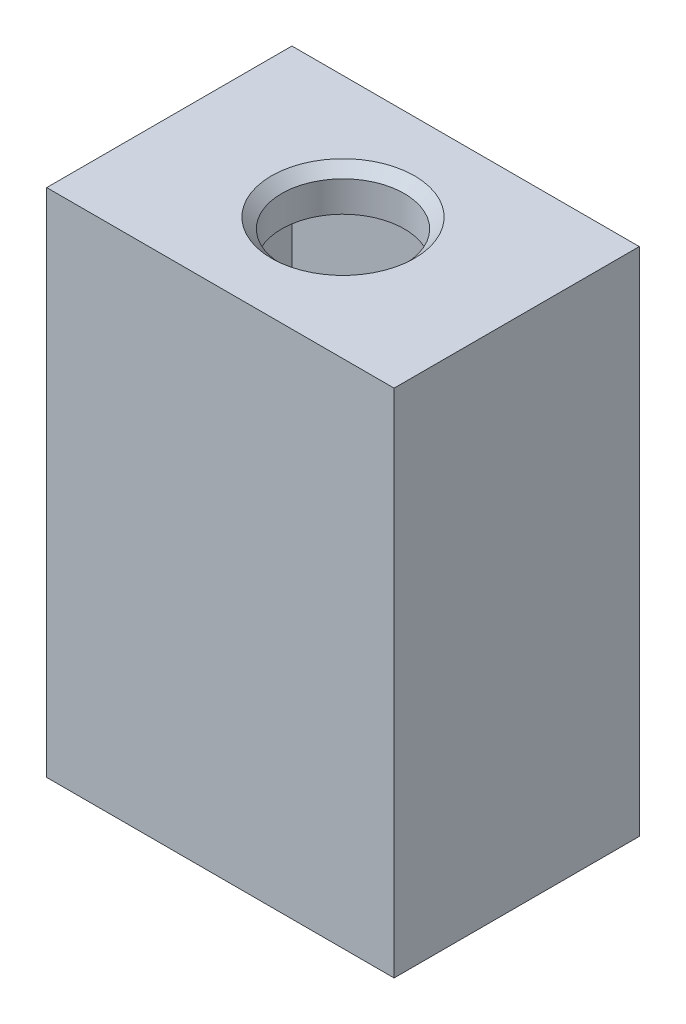
ISO-10303-21;
HEADER;
FILE_DESCRIPTION(('STEP AP214'),'2;1');
FILE_NAME('part.step','',(''),(''),'','','');
FILE_SCHEMA(('AUTOMOTIVE_DESIGN { 1 0 10303 214 1 1 1 1 }'));
ENDSEC;
DATA;
#1=APPLICATION_CONTEXT('core data for automotive mechanical design processes');
#2=APPLICATION_PROTOCOL_DEFINITION('international standard','automotive_design',2000,#1);
#3=PRODUCT_CONTEXT('',#1,'mechanical');
#4=PRODUCT('Part','Part','',(#3));
#5=PRODUCT_RELATED_PRODUCT_CATEGORY('part','',(#4));
#6=PRODUCT_DEFINITION_FORMATION('','',#4);
#7=PRODUCT_DEFINITION_CONTEXT('part definition',#1,'design');
#8=PRODUCT_DEFINITION('design','',#6,#7);
#9=PRODUCT_DEFINITION_SHAPE('','',#8);
#10=(LENGTH_UNIT() NAMED_UNIT(*) SI_UNIT(.MILLI.,.METRE.));
#11=(NAMED_UNIT(*) PLANE_ANGLE_UNIT() SI_UNIT($,.RADIAN.));
#12=(NAMED_UNIT(*) SI_UNIT($,.STERADIAN.) SOLID_ANGLE_UNIT());
#13=UNCERTAINTY_MEASURE_WITH_UNIT(LENGTH_MEASURE(1.E-05),#10,'distance_accuracy_value','');
#14=(GEOMETRIC_REPRESENTATION_CONTEXT(3) GLOBAL_UNCERTAINTY_ASSIGNED_CONTEXT((#13)) GLOBAL_UNIT_ASSIGNED_CONTEXT((#10,
#11,#12)) REPRESENTATION_CONTEXT('',''));
#15=CARTESIAN_POINT('',(0.,0.,0.));
#16=DIRECTION('',(0.,0.,1.));
#17=DIRECTION('',(1.,0.,0.));
#18=AXIS2_PLACEMENT_3D('',#15,#16,#17);
#19=CARTESIAN_POINT('',(0.,0.,0.));
#20=DIRECTION('',(0.,1.,0.));
#21=DIRECTION('',(0.,0.,1.));
#22=AXIS2_PLACEMENT_3D('',#19,#20,#21);
#23=PLANE('',#22);
#24=CARTESIAN_POINT('',(0.,0.,0.));
#25=DIRECTION('',(0.,1.,0.));
#26=DIRECTION('',(0.,0.,1.));
#27=AXIS2_PLACEMENT_3D('',#24,#25,#26);
#28=CIRCLE('',#27,3.);
#29=CARTESIAN_POINT('',(0.,0.,3.));
#30=VERTEX_POINT('',#29);
#31=EDGE_CURVE('E151',#30,#30,#28,.T.);
#32=ORIENTED_EDGE('',*,*,#31,.T.);
#33=EDGE_LOOP('',(#32));
#34=FACE_BOUND('',#33,.T.);
#35=DIRECTION('',(0.,0.,1.));
#36=VECTOR('',#35,1.);
#37=CARTESIAN_POINT('',(-7.,0.,-4.5));
#38=LINE('',#37,#36);
#39=CARTESIAN_POINT('',(-7.,0.,-4.5));
#40=VERTEX_POINT('',#39);
#41=CARTESIAN_POINT('',(-7.,0.,4.5));
#42=VERTEX_POINT('',#41);
#43=EDGE_CURVE('E51',#40,#42,#38,.T.);
#44=ORIENTED_EDGE('',*,*,#43,.F.);
#45=DIRECTION('',(-1.,0.,0.));
#46=VECTOR('',#45,1.);
#47=CARTESIAN_POINT('',(-7.,0.,-4.5));
#48=LINE('',#47,#46);
#49=CARTESIAN_POINT('',(7.,0.,-4.5));
#50=VERTEX_POINT('',#49);
#51=EDGE_CURVE('E56',#50,#40,#48,.T.);
#52=ORIENTED_EDGE('',*,*,#51,.F.);
#53=DIRECTION('',(0.,0.,-1.));
#54=VECTOR('',#53,1.);
#55=CARTESIAN_POINT('',(7.,0.,-4.5));
#56=LINE('',#55,#54);
#57=CARTESIAN_POINT('',(7.,0.,4.5));
#58=VERTEX_POINT('',#57);
#59=EDGE_CURVE('E124',#58,#50,#56,.T.);
#60=ORIENTED_EDGE('',*,*,#59,.F.);
#61=DIRECTION('',(1.,0.,0.));
#62=VECTOR('',#61,1.);
#63=CARTESIAN_POINT('',(-7.,0.,4.5));
#64=LINE('',#63,#62);
#65=EDGE_CURVE('E130',#42,#58,#64,.T.);
#66=ORIENTED_EDGE('',*,*,#65,.F.);
#67=EDGE_LOOP('',(#44,#52,#60,#66));
#68=FACE_BOUND('',#67,.T.);
#69=ADVANCED_FACE('F35',(#34,#68),#23,.F.);
#70=CARTESIAN_POINT('',(0.,2.,0.));
#71=DIRECTION('',(0.,1.,0.));
#72=DIRECTION('',(0.,0.,1.));
#73=AXIS2_PLACEMENT_3D('',#70,#71,#72);
#74=PLANE('',#73);
#75=CARTESIAN_POINT('',(0.,2.,0.));
#76=DIRECTION('',(0.,1.,0.));
#77=DIRECTION('',(0.,0.,1.));
#78=AXIS2_PLACEMENT_3D('',#75,#76,#77);
#79=CIRCLE('',#78,3.5);
#80=CARTESIAN_POINT('',(0.,2.,3.5));
#81=VERTEX_POINT('',#80);
#82=EDGE_CURVE('E11',#81,#81,#79,.F.);
#83=ORIENTED_EDGE('',*,*,#82,.T.);
#84=EDGE_LOOP('',(#83));
#85=FACE_BOUND('',#84,.T.);
#86=DIRECTION('',(0.,0.,1.));
#87=VECTOR('',#86,1.);
#88=CARTESIAN_POINT('',(-8.5,2.,-6.));
#89=LINE('',#88,#87);
#90=CARTESIAN_POINT('',(-8.5,2.,-6.));
#91=VERTEX_POINT('',#90);
#92=CARTESIAN_POINT('',(-8.5,2.,6.));
#93=VERTEX_POINT('',#92);
#94=EDGE_CURVE('E154',#91,#93,#89,.T.);
#95=ORIENTED_EDGE('',*,*,#94,.T.);
#96=DIRECTION('',(1.,0.,0.));
#97=VECTOR('',#96,1.);
#98=CARTESIAN_POINT('',(-8.5,2.,6.));
#99=LINE('',#98,#97);
#100=CARTESIAN_POINT('',(8.5,2.,6.));
#101=VERTEX_POINT('',#100);
#102=EDGE_CURVE('E157',#93,#101,#99,.T.);
#103=ORIENTED_EDGE('',*,*,#102,.T.);
#104=DIRECTION('',(0.,0.,-1.));
#105=VECTOR('',#104,1.);
#106=CARTESIAN_POINT('',(8.5,2.,-6.));
#107=LINE('',#106,#105);
#108=CARTESIAN_POINT('',(8.5,2.,-6.));
#109=VERTEX_POINT('',#108);
#110=EDGE_CURVE('E159',#101,#109,#107,.T.);
#111=ORIENTED_EDGE('',*,*,#110,.T.);
#112=DIRECTION('',(-1.,0.,0.));
#113=VECTOR('',#112,1.);
#114=CARTESIAN_POINT('',(-8.5,2.,-6.));
#115=LINE('',#114,#113);
#116=EDGE_CURVE('E161',#109,#91,#115,.T.);
#117=ORIENTED_EDGE('',*,*,#116,.T.);
#118=EDGE_LOOP('',(#95,#103,#111,#117));
#119=FACE_BOUND('',#118,.T.);
#120=ADVANCED_FACE('F185',(#85,#119),#74,.T.);
#121=CARTESIAN_POINT('',(-8.5,2.,-6.));
#122=DIRECTION('',(1.,0.,0.));
#123=DIRECTION('',(0.,0.,-1.));
#124=AXIS2_PLACEMENT_3D('',#121,#122,#123);
#125=PLANE('',#124);
#126=DIRECTION('',(0.,-1.,0.));
#127=VECTOR('',#126,1.);
#128=CARTESIAN_POINT('',(-8.5,2.,-6.));
#129=LINE('',#128,#127);
#130=CARTESIAN_POINT('',(-8.5,-23.,-6.));
#131=VERTEX_POINT('',#130);
#132=EDGE_CURVE('E163',#91,#131,#129,.T.);
#133=ORIENTED_EDGE('',*,*,#132,.T.);
#134=DIRECTION('',(0.,0.,1.));
#135=VECTOR('',#134,1.);
#136=CARTESIAN_POINT('',(-8.5,-23.,-6.));
#137=LINE('',#136,#135);
#138=CARTESIAN_POINT('',(-8.5,-23.,6.));
#139=VERTEX_POINT('',#138);
#140=EDGE_CURVE('E136',#131,#139,#137,.T.);
#141=ORIENTED_EDGE('',*,*,#140,.T.);
#142=DIRECTION('',(0.,-1.,0.));
#143=VECTOR('',#142,1.);
#144=CARTESIAN_POINT('',(-8.5,2.,6.));
#145=LINE('',#144,#143);
#146=EDGE_CURVE('E169',#93,#139,#145,.T.);
#147=ORIENTED_EDGE('',*,*,#146,.F.);
#148=ORIENTED_EDGE('',*,*,#94,.F.);
#149=EDGE_LOOP('',(#133,#141,#147,#148));
#150=FACE_BOUND('',#149,.T.);
#151=ADVANCED_FACE('F191',(#150),#125,.F.);
#152=CARTESIAN_POINT('',(-8.5,2.,6.));
#153=DIRECTION('',(0.,0.,-1.));
#154=DIRECTION('',(-1.,0.,0.));
#155=AXIS2_PLACEMENT_3D('',#152,#153,#154);
#156=PLANE('',#155);
#157=ORIENTED_EDGE('',*,*,#146,.T.);
#158=DIRECTION('',(1.,0.,0.));
#159=VECTOR('',#158,1.);
#160=CARTESIAN_POINT('',(-8.5,-23.,6.));
#161=LINE('',#160,#159);
#162=CARTESIAN_POINT('',(8.5,-23.,6.));
#163=VERTEX_POINT('',#162);
#164=EDGE_CURVE('E142',#139,#163,#161,.T.);
#165=ORIENTED_EDGE('',*,*,#164,.T.);
#166=DIRECTION('',(0.,-1.,0.));
#167=VECTOR('',#166,1.);
#168=CARTESIAN_POINT('',(8.5,2.,6.));
#169=LINE('',#168,#167);
#170=EDGE_CURVE('E167',#101,#163,#169,.T.);
#171=ORIENTED_EDGE('',*,*,#170,.F.);
#172=ORIENTED_EDGE('',*,*,#102,.F.);
#173=EDGE_LOOP('',(#157,#165,#171,#172));
#174=FACE_BOUND('',#173,.T.);
#175=ADVANCED_FACE('F203',(#174),#156,.F.);
#176=CARTESIAN_POINT('',(8.5,2.,-6.));
#177=DIRECTION('',(-1.,0.,0.));
#178=DIRECTION('',(0.,0.,1.));
#179=AXIS2_PLACEMENT_3D('',#176,#177,#178);
#180=PLANE('',#179);
#181=ORIENTED_EDGE('',*,*,#170,.T.);
#182=DIRECTION('',(0.,0.,-1.));
#183=VECTOR('',#182,1.);
#184=CARTESIAN_POINT('',(8.5,-23.,-6.));
#185=LINE('',#184,#183);
#186=CARTESIAN_POINT('',(8.5,-23.,-6.));
#187=VERTEX_POINT('',#186);
#188=EDGE_CURVE('E145',#163,#187,#185,.T.);
#189=ORIENTED_EDGE('',*,*,#188,.T.);
#190=DIRECTION('',(0.,-1.,0.));
#191=VECTOR('',#190,1.);
#192=CARTESIAN_POINT('',(8.5,2.,-6.));
#193=LINE('',#192,#191);
#194=EDGE_CURVE('E165',#109,#187,#193,.T.);
#195=ORIENTED_EDGE('',*,*,#194,.F.);
#196=ORIENTED_EDGE('',*,*,#110,.F.);
#197=EDGE_LOOP('',(#181,#189,#195,#196));
#198=FACE_BOUND('',#197,.T.);
#199=ADVANCED_FACE('F199',(#198),#180,.F.);
#200=CARTESIAN_POINT('',(-8.5,2.,-6.));
#201=DIRECTION('',(0.,0.,1.));
#202=DIRECTION('',(1.,0.,0.));
#203=AXIS2_PLACEMENT_3D('',#200,#201,#202);
#204=PLANE('',#203);
#205=ORIENTED_EDGE('',*,*,#194,.T.);
#206=DIRECTION('',(-1.,0.,0.));
#207=VECTOR('',#206,1.);
#208=CARTESIAN_POINT('',(-8.5,-23.,-6.));
#209=LINE('',#208,#207);
#210=EDGE_CURVE('E148',#187,#131,#209,.T.);
#211=ORIENTED_EDGE('',*,*,#210,.T.);
#212=ORIENTED_EDGE('',*,*,#132,.F.);
#213=ORIENTED_EDGE('',*,*,#116,.F.);
#214=EDGE_LOOP('',(#205,#211,#212,#213));
#215=FACE_BOUND('',#214,.T.);
#216=ADVANCED_FACE('F196',(#215),#204,.F.);
#217=CARTESIAN_POINT('',(0.,2.,0.));
#218=DIRECTION('',(0.,-1.,0.));
#219=DIRECTION('',(0.,0.,-1.));
#220=AXIS2_PLACEMENT_3D('',#217,#218,#219);
#221=CYLINDRICAL_SURFACE('',#220,3.);
#222=CARTESIAN_POINT('',(0.,1.5,0.));
#223=DIRECTION('',(0.,1.,0.));
#224=DIRECTION('',(0.,0.,1.));
#225=AXIS2_PLACEMENT_3D('',#222,#223,#224);
#226=CIRCLE('',#225,3.);
#227=CARTESIAN_POINT('',(0.,1.5,3.));
#228=VERTEX_POINT('',#227);
#229=EDGE_CURVE('E44',#228,#228,#226,.T.);
#230=ORIENTED_EDGE('',*,*,#229,.T.);
#231=EDGE_LOOP('',(#230));
#232=FACE_BOUND('',#231,.T.);
#233=ORIENTED_EDGE('',*,*,#31,.F.);
#234=EDGE_LOOP('',(#233));
#235=FACE_BOUND('',#234,.T.);
#236=ADVANCED_FACE('F173',(#232,#235),#221,.F.);
#237=CARTESIAN_POINT('',(0.,-23.,0.));
#238=DIRECTION('',(0.,1.,0.));
#239=DIRECTION('',(0.,0.,1.));
#240=AXIS2_PLACEMENT_3D('',#237,#238,#239);
#241=PLANE('',#240);
#242=DIRECTION('',(-1.,0.,0.));
#243=VECTOR('',#242,1.);
#244=CARTESIAN_POINT('',(-7.,-23.,-4.5));
#245=LINE('',#244,#243);
#246=CARTESIAN_POINT('',(7.,-23.,-4.5));
#247=VERTEX_POINT('',#246);
#248=CARTESIAN_POINT('',(-7.,-23.,-4.5));
#249=VERTEX_POINT('',#248);
#250=EDGE_CURVE('E109',#247,#249,#245,.T.);
#251=ORIENTED_EDGE('',*,*,#250,.T.);
#252=DIRECTION('',(0.,0.,1.));
#253=VECTOR('',#252,1.);
#254=CARTESIAN_POINT('',(-7.,-23.,-4.5));
#255=LINE('',#254,#253);
#256=CARTESIAN_POINT('',(-7.,-23.,4.5));
#257=VERTEX_POINT('',#256);
#258=EDGE_CURVE('E104',#249,#257,#255,.T.);
#259=ORIENTED_EDGE('',*,*,#258,.T.);
#260=DIRECTION('',(1.,0.,0.));
#261=VECTOR('',#260,1.);
#262=CARTESIAN_POINT('',(-7.,-23.,4.5));
#263=LINE('',#262,#261);
#264=CARTESIAN_POINT('',(7.,-23.,4.5));
#265=VERTEX_POINT('',#264);
#266=EDGE_CURVE('E113',#257,#265,#263,.T.);
#267=ORIENTED_EDGE('',*,*,#266,.T.);
#268=DIRECTION('',(0.,0.,-1.));
#269=VECTOR('',#268,1.);
#270=CARTESIAN_POINT('',(7.,-23.,-4.5));
#271=LINE('',#270,#269);
#272=EDGE_CURVE('E118',#265,#247,#271,.T.);
#273=ORIENTED_EDGE('',*,*,#272,.T.);
#274=EDGE_LOOP('',(#251,#259,#267,#273));
#275=FACE_BOUND('',#274,.T.);
#276=ORIENTED_EDGE('',*,*,#140,.F.);
#277=ORIENTED_EDGE('',*,*,#210,.F.);
#278=ORIENTED_EDGE('',*,*,#188,.F.);
#279=ORIENTED_EDGE('',*,*,#164,.F.);
#280=EDGE_LOOP('',(#276,#277,#278,#279));
#281=FACE_BOUND('',#280,.T.);
#282=ADVANCED_FACE('F120',(#275,#281),#241,.F.);
#283=CARTESIAN_POINT('',(-7.,-23.,-4.5));
#284=DIRECTION('',(-1.,0.,0.));
#285=DIRECTION('',(0.,0.,1.));
#286=AXIS2_PLACEMENT_3D('',#283,#284,#285);
#287=PLANE('',#286);
#288=ORIENTED_EDGE('',*,*,#43,.T.);
#289=DIRECTION('',(0.,1.,0.));
#290=VECTOR('',#289,1.);
#291=CARTESIAN_POINT('',(-7.,-23.,4.5));
#292=LINE('',#291,#290);
#293=EDGE_CURVE('E100',#257,#42,#292,.T.);
#294=ORIENTED_EDGE('',*,*,#293,.F.);
#295=ORIENTED_EDGE('',*,*,#258,.F.);
#296=DIRECTION('',(0.,1.,0.));
#297=VECTOR('',#296,1.);
#298=CARTESIAN_POINT('',(-7.,-23.,-4.5));
#299=LINE('',#298,#297);
#300=EDGE_CURVE('E134',#249,#40,#299,.T.);
#301=ORIENTED_EDGE('',*,*,#300,.T.);
#302=EDGE_LOOP('',(#288,#294,#295,#301));
#303=FACE_BOUND('',#302,.T.);
#304=ADVANCED_FACE('F102',(#303),#287,.F.);
#305=CARTESIAN_POINT('',(-7.,-23.,-4.5));
#306=DIRECTION('',(0.,0.,-1.));
#307=DIRECTION('',(-1.,0.,0.));
#308=AXIS2_PLACEMENT_3D('',#305,#306,#307);
#309=PLANE('',#308);
#310=ORIENTED_EDGE('',*,*,#51,.T.);
#311=ORIENTED_EDGE('',*,*,#300,.F.);
#312=ORIENTED_EDGE('',*,*,#250,.F.);
#313=DIRECTION('',(0.,1.,0.));
#314=VECTOR('',#313,1.);
#315=CARTESIAN_POINT('',(7.,-23.,-4.5));
#316=LINE('',#315,#314);
#317=EDGE_CURVE('E137',#247,#50,#316,.T.);
#318=ORIENTED_EDGE('',*,*,#317,.T.);
#319=EDGE_LOOP('',(#310,#311,#312,#318));
#320=FACE_BOUND('',#319,.T.);
#321=ADVANCED_FACE('F229',(#320),#309,.F.);
#322=CARTESIAN_POINT('',(7.,-23.,-4.5));
#323=DIRECTION('',(1.,0.,0.));
#324=DIRECTION('',(0.,0.,-1.));
#325=AXIS2_PLACEMENT_3D('',#322,#323,#324);
#326=PLANE('',#325);
#327=ORIENTED_EDGE('',*,*,#59,.T.);
#328=ORIENTED_EDGE('',*,*,#317,.F.);
#329=ORIENTED_EDGE('',*,*,#272,.F.);
#330=DIRECTION('',(0.,1.,0.));
#331=VECTOR('',#330,1.);
#332=CARTESIAN_POINT('',(7.,-23.,4.5));
#333=LINE('',#332,#331);
#334=EDGE_CURVE('E108',#265,#58,#333,.T.);
#335=ORIENTED_EDGE('',*,*,#334,.T.);
#336=EDGE_LOOP('',(#327,#328,#329,#335));
#337=FACE_BOUND('',#336,.T.);
#338=ADVANCED_FACE('F181',(#337),#326,.F.);
#339=CARTESIAN_POINT('',(-7.,-23.,4.5));
#340=DIRECTION('',(0.,0.,1.));
#341=DIRECTION('',(1.,0.,0.));
#342=AXIS2_PLACEMENT_3D('',#339,#340,#341);
#343=PLANE('',#342);
#344=ORIENTED_EDGE('',*,*,#65,.T.);
#345=ORIENTED_EDGE('',*,*,#334,.F.);
#346=ORIENTED_EDGE('',*,*,#266,.F.);
#347=ORIENTED_EDGE('',*,*,#293,.T.);
#348=EDGE_LOOP('',(#344,#345,#346,#347));
#349=FACE_BOUND('',#348,.T.);
#350=ADVANCED_FACE('F114',(#349),#343,.F.);
#351=CARTESIAN_POINT('',(0.,1.5,0.));
#352=DIRECTION('',(0.,1.,0.));
#353=DIRECTION('',(0.,0.,1.));
#354=AXIS2_PLACEMENT_3D('',#351,#352,#353);
#355=CONICAL_SURFACE('',#354,3.,0.785398163397452);
#356=ORIENTED_EDGE('',*,*,#82,.F.);
#357=EDGE_LOOP('',(#356));
#358=FACE_BOUND('',#357,.T.);
#359=ORIENTED_EDGE('',*,*,#229,.F.);
#360=EDGE_LOOP('',(#359));
#361=FACE_BOUND('',#360,.T.);
#362=ADVANCED_FACE('F38',(#358,#361),#355,.F.);
#363=CLOSED_SHELL('',(#69,#120,#151,#175,#199,#216,#236,#282,#304,#321,#338,#350,#362));
#364=MANIFOLD_SOLID_BREP('B2',#363);
#365=ADVANCED_BREP_SHAPE_REPRESENTATION('',(#18,#364),#14);
#366=SHAPE_DEFINITION_REPRESENTATION(#9,#365);
ENDSEC;
END-ISO-10303-21;
